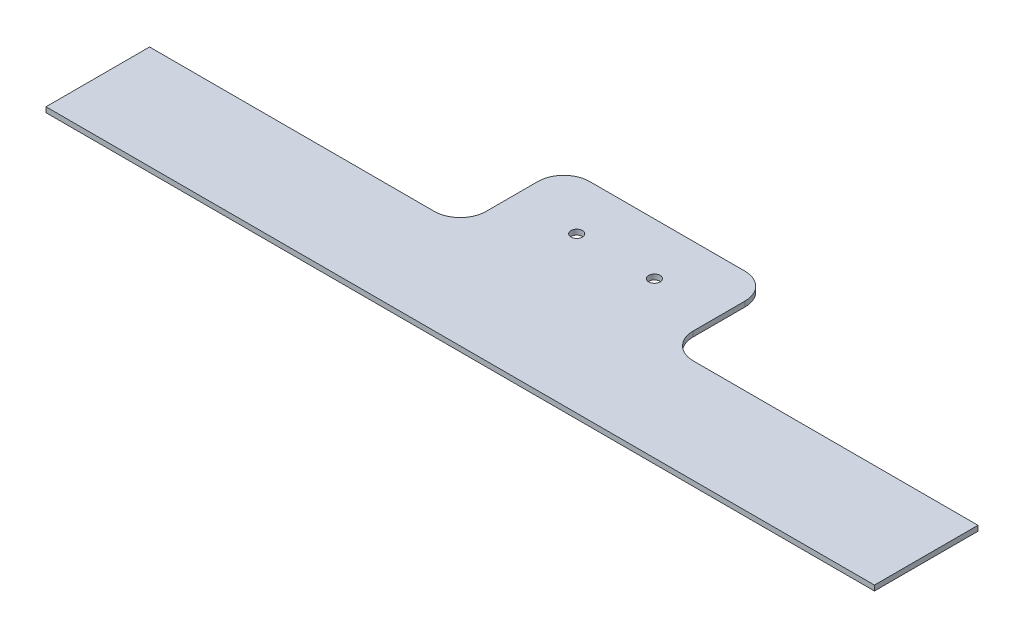
ISO-10303-21;
HEADER;
FILE_DESCRIPTION(('STEP AP214'),'2;1');
FILE_NAME('part.step','',(''),(''),'','','');
FILE_SCHEMA(('AUTOMOTIVE_DESIGN { 1 0 10303 214 1 1 1 1 }'));
ENDSEC;
DATA;
#1=APPLICATION_CONTEXT('core data for automotive mechanical design processes');
#2=APPLICATION_PROTOCOL_DEFINITION('international standard','automotive_design',2000,#1);
#3=PRODUCT_CONTEXT('',#1,'mechanical');
#4=PRODUCT('Part','Part','',(#3));
#5=PRODUCT_RELATED_PRODUCT_CATEGORY('part','',(#4));
#6=PRODUCT_DEFINITION_FORMATION('','',#4);
#7=PRODUCT_DEFINITION_CONTEXT('part definition',#1,'design');
#8=PRODUCT_DEFINITION('design','',#6,#7);
#9=PRODUCT_DEFINITION_SHAPE('','',#8);
#10=(LENGTH_UNIT() NAMED_UNIT(*) SI_UNIT(.MILLI.,.METRE.));
#11=(NAMED_UNIT(*) PLANE_ANGLE_UNIT() SI_UNIT($,.RADIAN.));
#12=(NAMED_UNIT(*) SI_UNIT($,.STERADIAN.) SOLID_ANGLE_UNIT());
#13=UNCERTAINTY_MEASURE_WITH_UNIT(LENGTH_MEASURE(1.E-05),#10,'distance_accuracy_value','');
#14=(GEOMETRIC_REPRESENTATION_CONTEXT(3) GLOBAL_UNCERTAINTY_ASSIGNED_CONTEXT((#13)) GLOBAL_UNIT_ASSIGNED_CONTEXT((#10,
#11,#12)) REPRESENTATION_CONTEXT('',''));
#15=CARTESIAN_POINT('',(0.,0.,0.));
#16=DIRECTION('',(0.,0.,1.));
#17=DIRECTION('',(1.,0.,0.));
#18=AXIS2_PLACEMENT_3D('',#15,#16,#17);
#19=CARTESIAN_POINT('',(0.,2.54,0.));
#20=DIRECTION('',(0.,0.,-1.));
#21=DIRECTION('',(-1.,0.,0.));
#22=AXIS2_PLACEMENT_3D('',#19,#20,#21);
#23=PLANE('',#22);
#24=DIRECTION('',(1.,0.,0.));
#25=VECTOR('',#24,1.);
#26=CARTESIAN_POINT('',(0.,0.,0.));
#27=LINE('',#26,#25);
#28=CARTESIAN_POINT('',(0.,0.,0.));
#29=VERTEX_POINT('',#28);
#30=CARTESIAN_POINT('',(406.4,0.,0.));
#31=VERTEX_POINT('',#30);
#32=EDGE_CURVE('E147',#29,#31,#27,.T.);
#33=ORIENTED_EDGE('',*,*,#32,.T.);
#34=DIRECTION('',(0.,-1.,0.));
#35=VECTOR('',#34,1.);
#36=CARTESIAN_POINT('',(406.4,2.54,0.));
#37=LINE('',#36,#35);
#38=CARTESIAN_POINT('',(406.4,2.54,0.));
#39=VERTEX_POINT('',#38);
#40=EDGE_CURVE('E129',#39,#31,#37,.T.);
#41=ORIENTED_EDGE('',*,*,#40,.F.);
#42=DIRECTION('',(1.,0.,0.));
#43=VECTOR('',#42,1.);
#44=CARTESIAN_POINT('',(0.,2.54,0.));
#45=LINE('',#44,#43);
#46=CARTESIAN_POINT('',(0.,2.54,0.));
#47=VERTEX_POINT('',#46);
#48=EDGE_CURVE('E135',#47,#39,#45,.T.);
#49=ORIENTED_EDGE('',*,*,#48,.F.);
#50=DIRECTION('',(0.,-1.,0.));
#51=VECTOR('',#50,1.);
#52=CARTESIAN_POINT('',(0.,2.54,0.));
#53=LINE('',#52,#51);
#54=EDGE_CURVE('E219',#47,#29,#53,.T.);
#55=ORIENTED_EDGE('',*,*,#54,.T.);
#56=EDGE_LOOP('',(#33,#41,#49,#55));
#57=FACE_BOUND('',#56,.T.);
#58=ADVANCED_FACE('F36',(#57),#23,.F.);
#59=CARTESIAN_POINT('',(406.4,2.54,0.));
#60=DIRECTION('',(-1.,0.,0.));
#61=DIRECTION('',(0.,0.,1.));
#62=AXIS2_PLACEMENT_3D('',#59,#60,#61);
#63=PLANE('',#62);
#64=DIRECTION('',(0.,0.,-1.));
#65=VECTOR('',#64,1.);
#66=CARTESIAN_POINT('',(406.4,0.,0.));
#67=LINE('',#66,#65);
#68=CARTESIAN_POINT('',(406.4,0.,-50.8));
#69=VERTEX_POINT('',#68);
#70=EDGE_CURVE('E223',#31,#69,#67,.T.);
#71=ORIENTED_EDGE('',*,*,#70,.T.);
#72=DIRECTION('',(0.,-1.,0.));
#73=VECTOR('',#72,1.);
#74=CARTESIAN_POINT('',(406.4,2.54,-50.8));
#75=LINE('',#74,#73);
#76=CARTESIAN_POINT('',(406.4,2.54,-50.8));
#77=VERTEX_POINT('',#76);
#78=EDGE_CURVE('E132',#77,#69,#75,.T.);
#79=ORIENTED_EDGE('',*,*,#78,.F.);
#80=DIRECTION('',(0.,0.,-1.));
#81=VECTOR('',#80,1.);
#82=CARTESIAN_POINT('',(406.4,2.54,0.));
#83=LINE('',#82,#81);
#84=EDGE_CURVE('E124',#39,#77,#83,.T.);
#85=ORIENTED_EDGE('',*,*,#84,.F.);
#86=ORIENTED_EDGE('',*,*,#40,.T.);
#87=EDGE_LOOP('',(#71,#79,#85,#86));
#88=FACE_BOUND('',#87,.T.);
#89=ADVANCED_FACE('F127',(#88),#63,.F.);
#90=CARTESIAN_POINT('',(0.,2.54,-50.8));
#91=DIRECTION('',(0.,0.,-1.));
#92=DIRECTION('',(-1.,0.,0.));
#93=AXIS2_PLACEMENT_3D('',#90,#91,#92);
#94=PLANE('',#93);
#95=DIRECTION('',(1.,0.,0.));
#96=VECTOR('',#95,1.);
#97=CARTESIAN_POINT('',(0.,0.,-50.8));
#98=LINE('',#97,#96);
#99=CARTESIAN_POINT('',(266.7,0.,-50.8));
#100=VERTEX_POINT('',#99);
#101=EDGE_CURVE('E213',#100,#69,#98,.T.);
#102=ORIENTED_EDGE('',*,*,#101,.F.);
#103=DIRECTION('',(0.,-1.,0.));
#104=VECTOR('',#103,1.);
#105=CARTESIAN_POINT('',(266.7,2.54,-50.8));
#106=LINE('',#105,#104);
#107=CARTESIAN_POINT('',(266.7,2.54,-50.8));
#108=VERTEX_POINT('',#107);
#109=EDGE_CURVE('E51',#100,#108,#106,.F.);
#110=ORIENTED_EDGE('',*,*,#109,.T.);
#111=DIRECTION('',(1.,0.,0.));
#112=VECTOR('',#111,1.);
#113=CARTESIAN_POINT('',(0.,2.54,-50.8));
#114=LINE('',#113,#112);
#115=EDGE_CURVE('E134',#108,#77,#114,.T.);
#116=ORIENTED_EDGE('',*,*,#115,.T.);
#117=ORIENTED_EDGE('',*,*,#78,.T.);
#118=EDGE_LOOP('',(#102,#110,#116,#117));
#119=FACE_BOUND('',#118,.T.);
#120=ADVANCED_FACE('F287',(#119),#94,.T.);
#121=CARTESIAN_POINT('',(254.,2.54,0.));
#122=DIRECTION('',(-1.,0.,0.));
#123=DIRECTION('',(0.,0.,1.));
#124=AXIS2_PLACEMENT_3D('',#121,#122,#123);
#125=PLANE('',#124);
#126=DIRECTION('',(0.,0.,-1.));
#127=VECTOR('',#126,1.);
#128=CARTESIAN_POINT('',(254.,2.54,0.));
#129=LINE('',#128,#127);
#130=CARTESIAN_POINT('',(254.,2.54,-63.5));
#131=VERTEX_POINT('',#130);
#132=CARTESIAN_POINT('',(254.,2.54,-88.9));
#133=VERTEX_POINT('',#132);
#134=EDGE_CURVE('E246',#131,#133,#129,.T.);
#135=ORIENTED_EDGE('',*,*,#134,.F.);
#136=DIRECTION('',(0.,-1.,0.));
#137=VECTOR('',#136,1.);
#138=CARTESIAN_POINT('',(254.,2.54,-63.5));
#139=LINE('',#138,#137);
#140=CARTESIAN_POINT('',(254.,0.,-63.5));
#141=VERTEX_POINT('',#140);
#142=EDGE_CURVE('E179',#131,#141,#139,.T.);
#143=ORIENTED_EDGE('',*,*,#142,.T.);
#144=DIRECTION('',(0.,0.,-1.));
#145=VECTOR('',#144,1.);
#146=CARTESIAN_POINT('',(254.,0.,0.));
#147=LINE('',#146,#145);
#148=CARTESIAN_POINT('',(254.,0.,-88.9));
#149=VERTEX_POINT('',#148);
#150=EDGE_CURVE('E214',#141,#149,#147,.T.);
#151=ORIENTED_EDGE('',*,*,#150,.T.);
#152=DIRECTION('',(0.,-1.,0.));
#153=VECTOR('',#152,1.);
#154=CARTESIAN_POINT('',(254.,2.54,-88.9));
#155=LINE('',#154,#153);
#156=EDGE_CURVE('E163',#149,#133,#155,.F.);
#157=ORIENTED_EDGE('',*,*,#156,.T.);
#158=EDGE_LOOP('',(#135,#143,#151,#157));
#159=FACE_BOUND('',#158,.T.);
#160=ADVANCED_FACE('F234',(#159),#125,.F.);
#161=CARTESIAN_POINT('',(0.,2.54,-101.6));
#162=DIRECTION('',(0.,0.,-1.));
#163=DIRECTION('',(-1.,0.,0.));
#164=AXIS2_PLACEMENT_3D('',#161,#162,#163);
#165=PLANE('',#164);
#166=DIRECTION('',(1.,0.,0.));
#167=VECTOR('',#166,1.);
#168=CARTESIAN_POINT('',(0.,2.54,-101.6));
#169=LINE('',#168,#167);
#170=CARTESIAN_POINT('',(165.1,2.54,-101.6));
#171=VERTEX_POINT('',#170);
#172=CARTESIAN_POINT('',(241.3,2.54,-101.6));
#173=VERTEX_POINT('',#172);
#174=EDGE_CURVE('E244',#171,#173,#169,.T.);
#175=ORIENTED_EDGE('',*,*,#174,.T.);
#176=DIRECTION('',(0.,-1.,0.));
#177=VECTOR('',#176,1.);
#178=CARTESIAN_POINT('',(241.3,0.,-101.6));
#179=LINE('',#178,#177);
#180=CARTESIAN_POINT('',(241.3,0.,-101.6));
#181=VERTEX_POINT('',#180);
#182=EDGE_CURVE('E150',#173,#181,#179,.T.);
#183=ORIENTED_EDGE('',*,*,#182,.T.);
#184=DIRECTION('',(1.,0.,0.));
#185=VECTOR('',#184,1.);
#186=CARTESIAN_POINT('',(0.,0.,-101.6));
#187=LINE('',#186,#185);
#188=CARTESIAN_POINT('',(165.1,0.,-101.6));
#189=VERTEX_POINT('',#188);
#190=EDGE_CURVE('E210',#189,#181,#187,.T.);
#191=ORIENTED_EDGE('',*,*,#190,.F.);
#192=DIRECTION('',(0.,-1.,0.));
#193=VECTOR('',#192,1.);
#194=CARTESIAN_POINT('',(165.1,2.54,-101.6));
#195=LINE('',#194,#193);
#196=EDGE_CURVE('E148',#189,#171,#195,.F.);
#197=ORIENTED_EDGE('',*,*,#196,.T.);
#198=EDGE_LOOP('',(#175,#183,#191,#197));
#199=FACE_BOUND('',#198,.T.);
#200=ADVANCED_FACE('F248',(#199),#165,.T.);
#201=CARTESIAN_POINT('',(152.4,2.54,0.));
#202=DIRECTION('',(-1.,0.,0.));
#203=DIRECTION('',(0.,0.,1.));
#204=AXIS2_PLACEMENT_3D('',#201,#202,#203);
#205=PLANE('',#204);
#206=DIRECTION('',(0.,0.,-1.));
#207=VECTOR('',#206,1.);
#208=CARTESIAN_POINT('',(152.4,0.,0.));
#209=LINE('',#208,#207);
#210=CARTESIAN_POINT('',(152.4,0.,-63.5));
#211=VERTEX_POINT('',#210);
#212=CARTESIAN_POINT('',(152.4,0.,-88.9));
#213=VERTEX_POINT('',#212);
#214=EDGE_CURVE('E203',#211,#213,#209,.T.);
#215=ORIENTED_EDGE('',*,*,#214,.F.);
#216=DIRECTION('',(0.,-1.,0.));
#217=VECTOR('',#216,1.);
#218=CARTESIAN_POINT('',(152.4,2.54,-63.5));
#219=LINE('',#218,#217);
#220=CARTESIAN_POINT('',(152.4,2.54,-63.5));
#221=VERTEX_POINT('',#220);
#222=EDGE_CURVE('E177',#211,#221,#219,.F.);
#223=ORIENTED_EDGE('',*,*,#222,.T.);
#224=DIRECTION('',(0.,0.,-1.));
#225=VECTOR('',#224,1.);
#226=CARTESIAN_POINT('',(152.4,2.54,0.));
#227=LINE('',#226,#225);
#228=CARTESIAN_POINT('',(152.4,2.54,-88.9));
#229=VERTEX_POINT('',#228);
#230=EDGE_CURVE('E190',#221,#229,#227,.T.);
#231=ORIENTED_EDGE('',*,*,#230,.T.);
#232=DIRECTION('',(0.,-1.,0.));
#233=VECTOR('',#232,1.);
#234=CARTESIAN_POINT('',(152.4,2.54,-88.9));
#235=LINE('',#234,#233);
#236=EDGE_CURVE('E171',#229,#213,#235,.T.);
#237=ORIENTED_EDGE('',*,*,#236,.T.);
#238=EDGE_LOOP('',(#215,#223,#231,#237));
#239=FACE_BOUND('',#238,.T.);
#240=ADVANCED_FACE('F208',(#239),#205,.T.);
#241=CARTESIAN_POINT('',(0.,2.54,-50.8));
#242=VERTEX_POINT('',#241);
#243=CARTESIAN_POINT('',(139.7,2.54,-50.8));
#244=VERTEX_POINT('',#243);
#245=EDGE_CURVE('E189',#242,#244,#114,.T.);
#246=ORIENTED_EDGE('',*,*,#245,.T.);
#247=DIRECTION('',(0.,-1.,0.));
#248=VECTOR('',#247,1.);
#249=CARTESIAN_POINT('',(139.7,0.,-50.8));
#250=LINE('',#249,#248);
#251=CARTESIAN_POINT('',(139.7,0.,-50.8));
#252=VERTEX_POINT('',#251);
#253=EDGE_CURVE('E174',#244,#252,#250,.T.);
#254=ORIENTED_EDGE('',*,*,#253,.T.);
#255=CARTESIAN_POINT('',(0.,0.,-50.8));
#256=VERTEX_POINT('',#255);
#257=EDGE_CURVE('E206',#256,#252,#98,.T.);
#258=ORIENTED_EDGE('',*,*,#257,.F.);
#259=DIRECTION('',(0.,-1.,0.));
#260=VECTOR('',#259,1.);
#261=CARTESIAN_POINT('',(0.,2.54,-50.8));
#262=LINE('',#261,#260);
#263=EDGE_CURVE('E152',#242,#256,#262,.T.);
#264=ORIENTED_EDGE('',*,*,#263,.F.);
#265=EDGE_LOOP('',(#246,#254,#258,#264));
#266=FACE_BOUND('',#265,.T.);
#267=ADVANCED_FACE('F195',(#266),#94,.T.);
#268=CARTESIAN_POINT('',(0.,2.54,0.));
#269=DIRECTION('',(-1.,0.,0.));
#270=DIRECTION('',(0.,0.,1.));
#271=AXIS2_PLACEMENT_3D('',#268,#269,#270);
#272=PLANE('',#271);
#273=DIRECTION('',(0.,0.,-1.));
#274=VECTOR('',#273,1.);
#275=CARTESIAN_POINT('',(0.,0.,0.));
#276=LINE('',#275,#274);
#277=EDGE_CURVE('E144',#29,#256,#276,.T.);
#278=ORIENTED_EDGE('',*,*,#277,.F.);
#279=ORIENTED_EDGE('',*,*,#54,.F.);
#280=DIRECTION('',(0.,0.,-1.));
#281=VECTOR('',#280,1.);
#282=CARTESIAN_POINT('',(0.,2.54,0.));
#283=LINE('',#282,#281);
#284=EDGE_CURVE('E142',#47,#242,#283,.T.);
#285=ORIENTED_EDGE('',*,*,#284,.T.);
#286=ORIENTED_EDGE('',*,*,#263,.T.);
#287=EDGE_LOOP('',(#278,#279,#285,#286));
#288=FACE_BOUND('',#287,.T.);
#289=ADVANCED_FACE('F222',(#288),#272,.T.);
#290=CARTESIAN_POINT('',(0.,2.54,0.));
#291=DIRECTION('',(0.,1.,0.));
#292=DIRECTION('',(0.,0.,1.));
#293=AXIS2_PLACEMENT_3D('',#290,#291,#292);
#294=PLANE('',#293);
#295=CARTESIAN_POINT('',(222.25,2.54,-76.2));
#296=DIRECTION('',(0.,1.,0.));
#297=DIRECTION('',(0.,0.,1.));
#298=AXIS2_PLACEMENT_3D('',#295,#296,#297);
#299=CIRCLE('',#298,2.79399999999998);
#300=CARTESIAN_POINT('',(222.25,2.54,-73.406));
#301=VERTEX_POINT('',#300);
#302=EDGE_CURVE('E228',#301,#301,#299,.T.);
#303=ORIENTED_EDGE('',*,*,#302,.F.);
#304=EDGE_LOOP('',(#303));
#305=FACE_BOUND('',#304,.T.);
#306=CARTESIAN_POINT('',(184.15,2.54,-76.2));
#307=DIRECTION('',(0.,1.,0.));
#308=DIRECTION('',(0.,0.,1.));
#309=AXIS2_PLACEMENT_3D('',#306,#307,#308);
#310=CIRCLE('',#309,2.79399999999998);
#311=CARTESIAN_POINT('',(184.15,2.54,-73.406));
#312=VERTEX_POINT('',#311);
#313=EDGE_CURVE('E253',#312,#312,#310,.T.);
#314=ORIENTED_EDGE('',*,*,#313,.F.);
#315=EDGE_LOOP('',(#314));
#316=FACE_BOUND('',#315,.T.);
#317=ORIENTED_EDGE('',*,*,#115,.F.);
#318=CARTESIAN_POINT('',(266.7,2.54,-63.5));
#319=DIRECTION('',(0.,1.,0.));
#320=DIRECTION('',(0.,0.,1.));
#321=AXIS2_PLACEMENT_3D('',#318,#319,#320);
#322=CIRCLE('',#321,12.7);
#323=EDGE_CURVE('E11',#108,#131,#322,.F.);
#324=ORIENTED_EDGE('',*,*,#323,.T.);
#325=ORIENTED_EDGE('',*,*,#134,.T.);
#326=CARTESIAN_POINT('',(241.3,2.54,-88.9));
#327=DIRECTION('',(0.,1.,0.));
#328=DIRECTION('',(0.,0.,1.));
#329=AXIS2_PLACEMENT_3D('',#326,#327,#328);
#330=CIRCLE('',#329,12.7);
#331=EDGE_CURVE('E169',#133,#173,#330,.T.);
#332=ORIENTED_EDGE('',*,*,#331,.T.);
#333=ORIENTED_EDGE('',*,*,#174,.F.);
#334=CARTESIAN_POINT('',(165.1,2.54,-88.9));
#335=DIRECTION('',(0.,1.,0.));
#336=DIRECTION('',(0.,0.,1.));
#337=AXIS2_PLACEMENT_3D('',#334,#335,#336);
#338=CIRCLE('',#337,12.7);
#339=EDGE_CURVE('E166',#171,#229,#338,.T.);
#340=ORIENTED_EDGE('',*,*,#339,.T.);
#341=ORIENTED_EDGE('',*,*,#230,.F.);
#342=CARTESIAN_POINT('',(139.7,2.54,-63.5));
#343=DIRECTION('',(0.,1.,0.));
#344=DIRECTION('',(0.,0.,1.));
#345=AXIS2_PLACEMENT_3D('',#342,#343,#344);
#346=CIRCLE('',#345,12.7);
#347=EDGE_CURVE('E185',#221,#244,#346,.F.);
#348=ORIENTED_EDGE('',*,*,#347,.T.);
#349=ORIENTED_EDGE('',*,*,#245,.F.);
#350=ORIENTED_EDGE('',*,*,#284,.F.);
#351=ORIENTED_EDGE('',*,*,#48,.T.);
#352=ORIENTED_EDGE('',*,*,#84,.T.);
#353=EDGE_LOOP('',(#317,#324,#325,#332,#333,#340,#341,#348,#349,#350,#351,#352));
#354=FACE_BOUND('',#353,.T.);
#355=ADVANCED_FACE('F139',(#305,#316,#354),#294,.T.);
#356=CARTESIAN_POINT('',(0.,0.,0.));
#357=DIRECTION('',(0.,1.,0.));
#358=DIRECTION('',(0.,0.,1.));
#359=AXIS2_PLACEMENT_3D('',#356,#357,#358);
#360=PLANE('',#359);
#361=CARTESIAN_POINT('',(222.25,0.,-76.2));
#362=DIRECTION('',(0.,1.,0.));
#363=DIRECTION('',(0.,0.,1.));
#364=AXIS2_PLACEMENT_3D('',#361,#362,#363);
#365=CIRCLE('',#364,2.79399999999998);
#366=CARTESIAN_POINT('',(222.25,0.,-73.406));
#367=VERTEX_POINT('',#366);
#368=EDGE_CURVE('E224',#367,#367,#365,.T.);
#369=ORIENTED_EDGE('',*,*,#368,.T.);
#370=EDGE_LOOP('',(#369));
#371=FACE_BOUND('',#370,.T.);
#372=CARTESIAN_POINT('',(184.15,0.,-76.2));
#373=DIRECTION('',(0.,1.,0.));
#374=DIRECTION('',(0.,0.,1.));
#375=AXIS2_PLACEMENT_3D('',#372,#373,#374);
#376=CIRCLE('',#375,2.79399999999998);
#377=CARTESIAN_POINT('',(184.15,0.,-73.406));
#378=VERTEX_POINT('',#377);
#379=EDGE_CURVE('E256',#378,#378,#376,.T.);
#380=ORIENTED_EDGE('',*,*,#379,.T.);
#381=EDGE_LOOP('',(#380));
#382=FACE_BOUND('',#381,.T.);
#383=ORIENTED_EDGE('',*,*,#190,.T.);
#384=CARTESIAN_POINT('',(241.3,0.,-88.9));
#385=DIRECTION('',(0.,1.,0.));
#386=DIRECTION('',(0.,0.,1.));
#387=AXIS2_PLACEMENT_3D('',#384,#385,#386);
#388=CIRCLE('',#387,12.7);
#389=EDGE_CURVE('E160',#181,#149,#388,.F.);
#390=ORIENTED_EDGE('',*,*,#389,.T.);
#391=ORIENTED_EDGE('',*,*,#150,.F.);
#392=CARTESIAN_POINT('',(266.7,0.,-63.5));
#393=DIRECTION('',(0.,1.,0.));
#394=DIRECTION('',(0.,0.,1.));
#395=AXIS2_PLACEMENT_3D('',#392,#393,#394);
#396=CIRCLE('',#395,12.7);
#397=EDGE_CURVE('E44',#141,#100,#396,.T.);
#398=ORIENTED_EDGE('',*,*,#397,.T.);
#399=ORIENTED_EDGE('',*,*,#101,.T.);
#400=ORIENTED_EDGE('',*,*,#70,.F.);
#401=ORIENTED_EDGE('',*,*,#32,.F.);
#402=ORIENTED_EDGE('',*,*,#277,.T.);
#403=ORIENTED_EDGE('',*,*,#257,.T.);
#404=CARTESIAN_POINT('',(139.7,0.,-63.5));
#405=DIRECTION('',(0.,1.,0.));
#406=DIRECTION('',(0.,0.,1.));
#407=AXIS2_PLACEMENT_3D('',#404,#405,#406);
#408=CIRCLE('',#407,12.7);
#409=EDGE_CURVE('E183',#252,#211,#408,.T.);
#410=ORIENTED_EDGE('',*,*,#409,.T.);
#411=ORIENTED_EDGE('',*,*,#214,.T.);
#412=CARTESIAN_POINT('',(165.1,0.,-88.9));
#413=DIRECTION('',(0.,1.,0.));
#414=DIRECTION('',(0.,0.,1.));
#415=AXIS2_PLACEMENT_3D('',#412,#413,#414);
#416=CIRCLE('',#415,12.7);
#417=EDGE_CURVE('E158',#213,#189,#416,.F.);
#418=ORIENTED_EDGE('',*,*,#417,.T.);
#419=EDGE_LOOP('',(#383,#390,#391,#398,#399,#400,#401,#402,#403,#410,#411,#418));
#420=FACE_BOUND('',#419,.T.);
#421=ADVANCED_FACE('F202',(#371,#382,#420),#360,.F.);
#422=CARTESIAN_POINT('',(184.15,0.,-76.2));
#423=DIRECTION('',(0.,1.,0.));
#424=DIRECTION('',(0.,0.,1.));
#425=AXIS2_PLACEMENT_3D('',#422,#423,#424);
#426=CYLINDRICAL_SURFACE('',#425,2.79399999999998);
#427=ORIENTED_EDGE('',*,*,#379,.F.);
#428=EDGE_LOOP('',(#427));
#429=FACE_BOUND('',#428,.T.);
#430=ORIENTED_EDGE('',*,*,#313,.T.);
#431=EDGE_LOOP('',(#430));
#432=FACE_BOUND('',#431,.T.);
#433=ADVANCED_FACE('F269',(#429,#432),#426,.F.);
#434=CARTESIAN_POINT('',(222.25,0.,-76.2));
#435=DIRECTION('',(0.,1.,0.));
#436=DIRECTION('',(0.,0.,1.));
#437=AXIS2_PLACEMENT_3D('',#434,#435,#436);
#438=CYLINDRICAL_SURFACE('',#437,2.79399999999998);
#439=ORIENTED_EDGE('',*,*,#368,.F.);
#440=EDGE_LOOP('',(#439));
#441=FACE_BOUND('',#440,.T.);
#442=ORIENTED_EDGE('',*,*,#302,.T.);
#443=EDGE_LOOP('',(#442));
#444=FACE_BOUND('',#443,.T.);
#445=ADVANCED_FACE('F262',(#441,#444),#438,.F.);
#446=CARTESIAN_POINT('',(241.3,2.54,-88.9));
#447=DIRECTION('',(0.,1.,0.));
#448=DIRECTION('',(0.,0.,1.));
#449=AXIS2_PLACEMENT_3D('',#446,#447,#448);
#450=CYLINDRICAL_SURFACE('',#449,12.7);
#451=ORIENTED_EDGE('',*,*,#331,.F.);
#452=ORIENTED_EDGE('',*,*,#156,.F.);
#453=ORIENTED_EDGE('',*,*,#389,.F.);
#454=ORIENTED_EDGE('',*,*,#182,.F.);
#455=EDGE_LOOP('',(#451,#452,#453,#454));
#456=FACE_BOUND('',#455,.T.);
#457=ADVANCED_FACE('F241',(#456),#450,.T.);
#458=CARTESIAN_POINT('',(165.1,2.54,-88.9));
#459=DIRECTION('',(0.,-1.,0.));
#460=DIRECTION('',(0.,0.,-1.));
#461=AXIS2_PLACEMENT_3D('',#458,#459,#460);
#462=CYLINDRICAL_SURFACE('',#461,12.7);
#463=ORIENTED_EDGE('',*,*,#339,.F.);
#464=ORIENTED_EDGE('',*,*,#196,.F.);
#465=ORIENTED_EDGE('',*,*,#417,.F.);
#466=ORIENTED_EDGE('',*,*,#236,.F.);
#467=EDGE_LOOP('',(#463,#464,#465,#466));
#468=FACE_BOUND('',#467,.T.);
#469=ADVANCED_FACE('F293',(#468),#462,.T.);
#470=CARTESIAN_POINT('',(139.7,2.54,-63.5));
#471=DIRECTION('',(0.,1.,0.));
#472=DIRECTION('',(0.,0.,1.));
#473=AXIS2_PLACEMENT_3D('',#470,#471,#472);
#474=CYLINDRICAL_SURFACE('',#473,12.7);
#475=ORIENTED_EDGE('',*,*,#347,.F.);
#476=ORIENTED_EDGE('',*,*,#222,.F.);
#477=ORIENTED_EDGE('',*,*,#409,.F.);
#478=ORIENTED_EDGE('',*,*,#253,.F.);
#479=EDGE_LOOP('',(#475,#476,#477,#478));
#480=FACE_BOUND('',#479,.T.);
#481=ADVANCED_FACE('F199',(#480),#474,.F.);
#482=CARTESIAN_POINT('',(266.7,2.54,-63.5));
#483=DIRECTION('',(0.,-1.,0.));
#484=DIRECTION('',(0.,0.,-1.));
#485=AXIS2_PLACEMENT_3D('',#482,#483,#484);
#486=CYLINDRICAL_SURFACE('',#485,12.7);
#487=ORIENTED_EDGE('',*,*,#323,.F.);
#488=ORIENTED_EDGE('',*,*,#109,.F.);
#489=ORIENTED_EDGE('',*,*,#397,.F.);
#490=ORIENTED_EDGE('',*,*,#142,.F.);
#491=EDGE_LOOP('',(#487,#488,#489,#490));
#492=FACE_BOUND('',#491,.T.);
#493=ADVANCED_FACE('F38',(#492),#486,.F.);
#494=CLOSED_SHELL('',(#58,#89,#120,#160,#200,#240,#267,#289,#355,#421,#433,#445,#457,#469,#481,#493));
#495=MANIFOLD_SOLID_BREP('B2',#494);
#496=ADVANCED_BREP_SHAPE_REPRESENTATION('',(#18,#495),#14);
#497=SHAPE_DEFINITION_REPRESENTATION(#9,#496);
ENDSEC;
END-ISO-10303-21;
